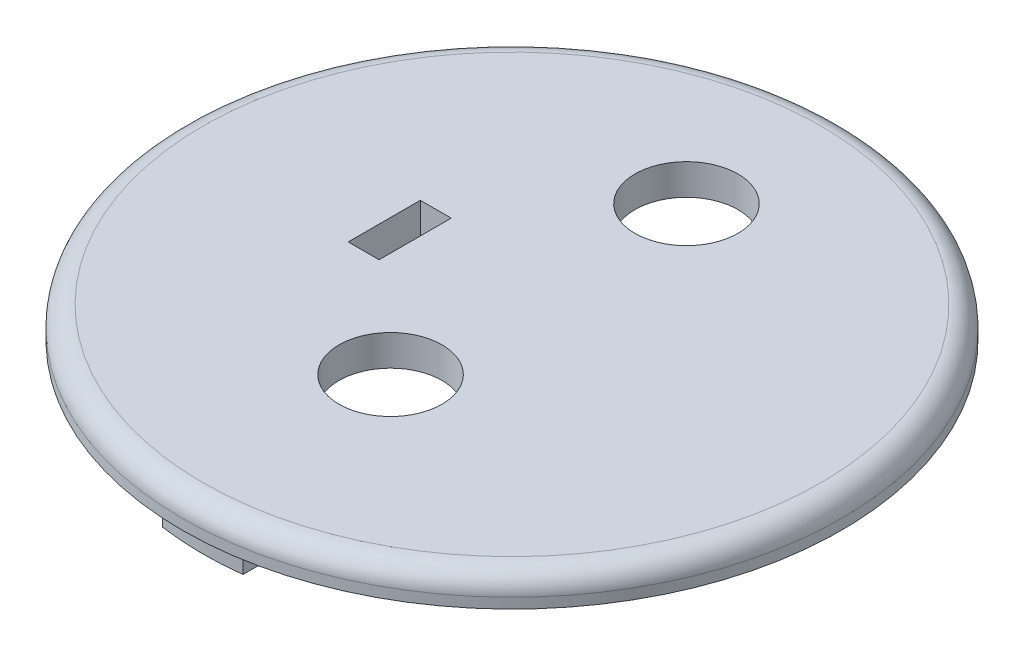
ISO-10303-21;
HEADER;
FILE_DESCRIPTION(('STEP AP214'),'2;1');
FILE_NAME('part.step','',(''),(''),'','','');
FILE_SCHEMA(('AUTOMOTIVE_DESIGN { 1 0 10303 214 1 1 1 1 }'));
ENDSEC;
DATA;
#1=APPLICATION_CONTEXT('core data for automotive mechanical design processes');
#2=APPLICATION_PROTOCOL_DEFINITION('international standard','automotive_design',2000,#1);
#3=PRODUCT_CONTEXT('',#1,'mechanical');
#4=PRODUCT('Part','Part','',(#3));
#5=PRODUCT_RELATED_PRODUCT_CATEGORY('part','',(#4));
#6=PRODUCT_DEFINITION_FORMATION('','',#4);
#7=PRODUCT_DEFINITION_CONTEXT('part definition',#1,'design');
#8=PRODUCT_DEFINITION('design','',#6,#7);
#9=PRODUCT_DEFINITION_SHAPE('','',#8);
#10=(LENGTH_UNIT() NAMED_UNIT(*) SI_UNIT(.MILLI.,.METRE.));
#11=(NAMED_UNIT(*) PLANE_ANGLE_UNIT() SI_UNIT($,.RADIAN.));
#12=(NAMED_UNIT(*) SI_UNIT($,.STERADIAN.) SOLID_ANGLE_UNIT());
#13=UNCERTAINTY_MEASURE_WITH_UNIT(LENGTH_MEASURE(1.E-05),#10,'distance_accuracy_value','');
#14=(GEOMETRIC_REPRESENTATION_CONTEXT(3) GLOBAL_UNCERTAINTY_ASSIGNED_CONTEXT((#13)) GLOBAL_UNIT_ASSIGNED_CONTEXT((#10,
#11,#12)) REPRESENTATION_CONTEXT('',''));
#15=CARTESIAN_POINT('',(0.,0.,0.));
#16=DIRECTION('',(0.,0.,1.));
#17=DIRECTION('',(1.,0.,0.));
#18=AXIS2_PLACEMENT_3D('',#15,#16,#17);
#19=CARTESIAN_POINT('',(0.,0.,0.));
#20=DIRECTION('',(0.,1.,0.));
#21=DIRECTION('',(0.,0.,1.));
#22=AXIS2_PLACEMENT_3D('',#19,#20,#21);
#23=PLANE('',#22);
#24=DIRECTION('',(-1.,0.,0.));
#25=VECTOR('',#24,1.);
#26=CARTESIAN_POINT('',(0.,0.,-4.29999938754221));
#27=LINE('',#26,#25);
#28=CARTESIAN_POINT('',(-10.203666827686,0.,-4.29999938754221));
#29=VERTEX_POINT('',#28);
#30=CARTESIAN_POINT('',(-13.203666827686,0.,-4.29999938754221));
#31=VERTEX_POINT('',#30);
#32=EDGE_CURVE('E158',#29,#31,#27,.T.);
#33=ORIENTED_EDGE('',*,*,#32,.T.);
#34=DIRECTION('',(0.,0.,1.));
#35=VECTOR('',#34,1.);
#36=CARTESIAN_POINT('',(-13.203666827686,0.,0.));
#37=LINE('',#36,#35);
#38=CARTESIAN_POINT('',(-13.203666827686,0.,2.70000061245779));
#39=VERTEX_POINT('',#38);
#40=EDGE_CURVE('E161',#31,#39,#37,.T.);
#41=ORIENTED_EDGE('',*,*,#40,.T.);
#42=DIRECTION('',(1.,0.,0.));
#43=VECTOR('',#42,1.);
#44=CARTESIAN_POINT('',(0.,0.,2.70000061245779));
#45=LINE('',#44,#43);
#46=CARTESIAN_POINT('',(-10.203666827686,0.,2.70000061245779));
#47=VERTEX_POINT('',#46);
#48=EDGE_CURVE('E153',#39,#47,#45,.T.);
#49=ORIENTED_EDGE('',*,*,#48,.T.);
#50=DIRECTION('',(0.,0.,-1.));
#51=VECTOR('',#50,1.);
#52=CARTESIAN_POINT('',(-10.203666827686,0.,0.));
#53=LINE('',#52,#51);
#54=EDGE_CURVE('E133',#47,#29,#53,.T.);
#55=ORIENTED_EDGE('',*,*,#54,.T.);
#56=EDGE_LOOP('',(#33,#41,#49,#55));
#57=FACE_BOUND('',#56,.T.);
#58=CARTESIAN_POINT('',(0.,0.,-16.9396462564265));
#59=DIRECTION('',(0.,1.,0.));
#60=DIRECTION('',(0.,0.,1.));
#61=AXIS2_PLACEMENT_3D('',#58,#59,#60);
#62=CIRCLE('',#61,5.);
#63=CARTESIAN_POINT('',(0.,0.,-11.9396462564265));
#64=VERTEX_POINT('',#63);
#65=EDGE_CURVE('E243',#64,#64,#62,.T.);
#66=ORIENTED_EDGE('',*,*,#65,.T.);
#67=EDGE_LOOP('',(#66));
#68=FACE_BOUND('',#67,.T.);
#69=CARTESIAN_POINT('',(0.,0.,11.7956699063071));
#70=DIRECTION('',(0.,1.,0.));
#71=DIRECTION('',(0.,0.,1.));
#72=AXIS2_PLACEMENT_3D('',#69,#70,#71);
#73=CIRCLE('',#72,5.);
#74=CARTESIAN_POINT('',(0.,0.,16.7956699063071));
#75=VERTEX_POINT('',#74);
#76=EDGE_CURVE('E242',#75,#75,#73,.T.);
#77=ORIENTED_EDGE('',*,*,#76,.T.);
#78=EDGE_LOOP('',(#77));
#79=FACE_BOUND('',#78,.T.);
#80=CARTESIAN_POINT('',(0.,0.,0.));
#81=DIRECTION('',(0.,1.,0.));
#82=DIRECTION('',(0.,0.,1.));
#83=AXIS2_PLACEMENT_3D('',#80,#81,#82);
#84=CIRCLE('',#83,32.);
#85=CARTESIAN_POINT('',(0.,0.,32.));
#86=VERTEX_POINT('',#85);
#87=EDGE_CURVE('E250',#86,#86,#84,.T.);
#88=ORIENTED_EDGE('',*,*,#87,.F.);
#89=EDGE_LOOP('',(#88));
#90=FACE_BOUND('',#89,.T.);
#91=CARTESIAN_POINT('',(-4.25281447665018,0.,-29.6970296330659));
#92=CARTESIAN_POINT('',(-0.301616898279549,0.,-30.2601976972511));
#93=CARTESIAN_POINT('',(3.65484317004238,0.,-29.7765364238757));
#94=B_SPLINE_CURVE_WITH_KNOTS('',2,(#91,#92,#93),.UNSPECIFIED.,.F.,.F.,(3,3),(0.,1.),.UNSPECIFIED.);
#95=CARTESIAN_POINT('',(-4.25281447665018,0.,-29.6970296330659));
#96=VERTEX_POINT('',#95);
#97=CARTESIAN_POINT('',(3.65484317004238,0.,-29.7765364238757));
#98=VERTEX_POINT('',#97);
#99=EDGE_CURVE('E238',#96,#98,#94,.T.);
#100=ORIENTED_EDGE('',*,*,#99,.F.);
#101=DIRECTION('',(0.,0.,1.));
#102=VECTOR('',#101,1.);
#103=CARTESIAN_POINT('',(-4.25281447665018,0.,-29.6970296330659));
#104=LINE('',#103,#102);
#105=CARTESIAN_POINT('',(-4.25281447665018,0.,-28.0928707699777));
#106=VERTEX_POINT('',#105);
#107=EDGE_CURVE('E225',#96,#106,#104,.T.);
#108=ORIENTED_EDGE('',*,*,#107,.T.);
#109=DIRECTION('',(1.,0.,0.));
#110=VECTOR('',#109,1.);
#111=CARTESIAN_POINT('',(-4.25281447665018,0.,-28.0928707699777));
#112=LINE('',#111,#110);
#113=CARTESIAN_POINT('',(3.65484317004238,0.,-28.0928707699777));
#114=VERTEX_POINT('',#113);
#115=EDGE_CURVE('E333',#106,#114,#112,.T.);
#116=ORIENTED_EDGE('',*,*,#115,.T.);
#117=DIRECTION('',(0.,0.,-1.));
#118=VECTOR('',#117,1.);
#119=CARTESIAN_POINT('',(3.65484317004238,0.,-28.0928707699777));
#120=LINE('',#119,#118);
#121=EDGE_CURVE('E329',#114,#98,#120,.T.);
#122=ORIENTED_EDGE('',*,*,#121,.T.);
#123=EDGE_LOOP('',(#100,#108,#116,#122));
#124=FACE_BOUND('',#123,.T.);
#125=DIRECTION('',(1.,0.,0.));
#126=VECTOR('',#125,1.);
#127=CARTESIAN_POINT('',(-4.25281447665018,0.,28.0928707699777));
#128=LINE('',#127,#126);
#129=CARTESIAN_POINT('',(-4.25281447665018,0.,28.0928707699777));
#130=VERTEX_POINT('',#129);
#131=CARTESIAN_POINT('',(3.65484317004238,0.,28.0928707699777));
#132=VERTEX_POINT('',#131);
#133=EDGE_CURVE('E294',#130,#132,#128,.T.);
#134=ORIENTED_EDGE('',*,*,#133,.F.);
#135=DIRECTION('',(0.,0.,-1.));
#136=VECTOR('',#135,1.);
#137=CARTESIAN_POINT('',(-4.25281447665018,0.,29.6970296330659));
#138=LINE('',#137,#136);
#139=CARTESIAN_POINT('',(-4.25281447665018,0.,29.6970296330659));
#140=VERTEX_POINT('',#139);
#141=EDGE_CURVE('E169',#140,#130,#138,.T.);
#142=ORIENTED_EDGE('',*,*,#141,.F.);
#143=CARTESIAN_POINT('',(-4.25281447665018,0.,29.6970296330659));
#144=CARTESIAN_POINT('',(-0.301616898279549,0.,30.2601976972511));
#145=CARTESIAN_POINT('',(3.65484317004238,0.,29.7765364238757));
#146=B_SPLINE_CURVE_WITH_KNOTS('',2,(#143,#144,#145),.UNSPECIFIED.,.F.,.F.,(3,3),(0.,1.),.UNSPECIFIED.);
#147=CARTESIAN_POINT('',(3.65484317004238,0.,29.7765364238757));
#148=VERTEX_POINT('',#147);
#149=EDGE_CURVE('E309',#140,#148,#146,.T.);
#150=ORIENTED_EDGE('',*,*,#149,.T.);
#151=DIRECTION('',(0.,0.,1.));
#152=VECTOR('',#151,1.);
#153=CARTESIAN_POINT('',(3.65484317004238,0.,28.0928707699777));
#154=LINE('',#153,#152);
#155=EDGE_CURVE('E298',#132,#148,#154,.T.);
#156=ORIENTED_EDGE('',*,*,#155,.F.);
#157=EDGE_LOOP('',(#134,#142,#150,#156));
#158=FACE_BOUND('',#157,.T.);
#159=ADVANCED_FACE('F38',(#57,#68,#79,#90,#124,#158),#23,.F.);
#160=CARTESIAN_POINT('',(0.,3.,0.));
#161=DIRECTION('',(0.,1.,0.));
#162=DIRECTION('',(0.,0.,1.));
#163=AXIS2_PLACEMENT_3D('',#160,#161,#162);
#164=PLANE('',#163);
#165=DIRECTION('',(0.,0.,1.));
#166=VECTOR('',#165,1.);
#167=CARTESIAN_POINT('',(-13.203666827686,3.,-4.29999938754221));
#168=LINE('',#167,#166);
#169=CARTESIAN_POINT('',(-13.203666827686,3.,-4.29999938754221));
#170=VERTEX_POINT('',#169);
#171=CARTESIAN_POINT('',(-13.203666827686,3.,2.70000061245779));
#172=VERTEX_POINT('',#171);
#173=EDGE_CURVE('E61',#170,#172,#168,.T.);
#174=ORIENTED_EDGE('',*,*,#173,.F.);
#175=DIRECTION('',(-1.,0.,0.));
#176=VECTOR('',#175,1.);
#177=CARTESIAN_POINT('',(-13.203666827686,3.,-4.29999938754221));
#178=LINE('',#177,#176);
#179=CARTESIAN_POINT('',(-10.203666827686,3.,-4.29999938754221));
#180=VERTEX_POINT('',#179);
#181=EDGE_CURVE('E146',#180,#170,#178,.T.);
#182=ORIENTED_EDGE('',*,*,#181,.F.);
#183=DIRECTION('',(0.,0.,-1.));
#184=VECTOR('',#183,1.);
#185=CARTESIAN_POINT('',(-10.203666827686,3.,-4.29999938754221));
#186=LINE('',#185,#184);
#187=CARTESIAN_POINT('',(-10.203666827686,3.,2.70000061245779));
#188=VERTEX_POINT('',#187);
#189=EDGE_CURVE('E130',#188,#180,#186,.T.);
#190=ORIENTED_EDGE('',*,*,#189,.F.);
#191=DIRECTION('',(1.,0.,0.));
#192=VECTOR('',#191,1.);
#193=CARTESIAN_POINT('',(-13.203666827686,3.,2.70000061245779));
#194=LINE('',#193,#192);
#195=EDGE_CURVE('E139',#172,#188,#194,.T.);
#196=ORIENTED_EDGE('',*,*,#195,.F.);
#197=EDGE_LOOP('',(#174,#182,#190,#196));
#198=FACE_BOUND('',#197,.T.);
#199=CARTESIAN_POINT('',(0.,3.,0.));
#200=DIRECTION('',(0.,1.,0.));
#201=DIRECTION('',(0.,0.,1.));
#202=AXIS2_PLACEMENT_3D('',#199,#200,#201);
#203=CIRCLE('',#202,30.);
#204=CARTESIAN_POINT('',(0.,3.,30.));
#205=VERTEX_POINT('',#204);
#206=EDGE_CURVE('E46',#205,#205,#203,.T.);
#207=ORIENTED_EDGE('',*,*,#206,.T.);
#208=EDGE_LOOP('',(#207));
#209=FACE_BOUND('',#208,.T.);
#210=CARTESIAN_POINT('',(0.,3.,11.7956699063071));
#211=DIRECTION('',(0.,1.,0.));
#212=DIRECTION('',(0.,0.,1.));
#213=AXIS2_PLACEMENT_3D('',#210,#211,#212);
#214=CIRCLE('',#213,5.);
#215=CARTESIAN_POINT('',(0.,3.,16.7956699063071));
#216=VERTEX_POINT('',#215);
#217=EDGE_CURVE('E247',#216,#216,#214,.T.);
#218=ORIENTED_EDGE('',*,*,#217,.F.);
#219=EDGE_LOOP('',(#218));
#220=FACE_BOUND('',#219,.T.);
#221=CARTESIAN_POINT('',(0.,3.,-16.9396462564265));
#222=DIRECTION('',(0.,1.,0.));
#223=DIRECTION('',(0.,0.,1.));
#224=AXIS2_PLACEMENT_3D('',#221,#222,#223);
#225=CIRCLE('',#224,5.);
#226=CARTESIAN_POINT('',(0.,3.,-11.9396462564265));
#227=VERTEX_POINT('',#226);
#228=EDGE_CURVE('E239',#227,#227,#225,.T.);
#229=ORIENTED_EDGE('',*,*,#228,.F.);
#230=EDGE_LOOP('',(#229));
#231=FACE_BOUND('',#230,.T.);
#232=ADVANCED_FACE('F143',(#198,#209,#220,#231),#164,.T.);
#233=CARTESIAN_POINT('',(0.,3.,0.));
#234=DIRECTION('',(0.,-1.,0.));
#235=DIRECTION('',(0.,0.,-1.));
#236=AXIS2_PLACEMENT_3D('',#233,#234,#235);
#237=CYLINDRICAL_SURFACE('',#236,32.);
#238=CARTESIAN_POINT('',(0.,1.,0.));
#239=DIRECTION('',(0.,1.,0.));
#240=DIRECTION('',(0.,0.,1.));
#241=AXIS2_PLACEMENT_3D('',#238,#239,#240);
#242=CIRCLE('',#241,32.);
#243=CARTESIAN_POINT('',(0.,1.,32.));
#244=VERTEX_POINT('',#243);
#245=EDGE_CURVE('E11',#244,#244,#242,.F.);
#246=ORIENTED_EDGE('',*,*,#245,.T.);
#247=EDGE_LOOP('',(#246));
#248=FACE_BOUND('',#247,.T.);
#249=ORIENTED_EDGE('',*,*,#87,.T.);
#250=EDGE_LOOP('',(#249));
#251=FACE_BOUND('',#250,.T.);
#252=ADVANCED_FACE('F275',(#248,#251),#237,.T.);
#253=CARTESIAN_POINT('',(0.,3.,11.7956699063071));
#254=DIRECTION('',(0.,-1.,0.));
#255=DIRECTION('',(0.,0.,-1.));
#256=AXIS2_PLACEMENT_3D('',#253,#254,#255);
#257=CYLINDRICAL_SURFACE('',#256,5.);
#258=ORIENTED_EDGE('',*,*,#217,.T.);
#259=EDGE_LOOP('',(#258));
#260=FACE_BOUND('',#259,.T.);
#261=ORIENTED_EDGE('',*,*,#76,.F.);
#262=EDGE_LOOP('',(#261));
#263=FACE_BOUND('',#262,.T.);
#264=ADVANCED_FACE('F265',(#260,#263),#257,.F.);
#265=CARTESIAN_POINT('',(0.,3.,-16.9396462564265));
#266=DIRECTION('',(0.,-1.,0.));
#267=DIRECTION('',(0.,0.,-1.));
#268=AXIS2_PLACEMENT_3D('',#265,#266,#267);
#269=CYLINDRICAL_SURFACE('',#268,5.);
#270=ORIENTED_EDGE('',*,*,#228,.T.);
#271=EDGE_LOOP('',(#270));
#272=FACE_BOUND('',#271,.T.);
#273=ORIENTED_EDGE('',*,*,#65,.F.);
#274=EDGE_LOOP('',(#273));
#275=FACE_BOUND('',#274,.T.);
#276=ADVANCED_FACE('F259',(#272,#275),#269,.F.);
#277=CARTESIAN_POINT('',(0.,1.,0.));
#278=DIRECTION('',(0.,1.,0.));
#279=DIRECTION('',(0.,0.,1.));
#280=AXIS2_PLACEMENT_3D('',#277,#278,#279);
#281=TOROIDAL_SURFACE('',#280,30.,2.);
#282=ORIENTED_EDGE('',*,*,#245,.F.);
#283=EDGE_LOOP('',(#282));
#284=FACE_BOUND('',#283,.T.);
#285=ORIENTED_EDGE('',*,*,#206,.F.);
#286=EDGE_LOOP('',(#285));
#287=FACE_BOUND('',#286,.T.);
#288=ADVANCED_FACE('F40',(#284,#287),#281,.T.);
#289=CARTESIAN_POINT('',(-4.25281447665018,-3.,-29.6970296330659));
#290=DIRECTION('',(-1.,0.,0.));
#291=DIRECTION('',(0.,0.,1.));
#292=AXIS2_PLACEMENT_3D('',#289,#290,#291);
#293=PLANE('',#292);
#294=ORIENTED_EDGE('',*,*,#107,.F.);
#295=DIRECTION('',(0.,1.,0.));
#296=VECTOR('',#295,1.);
#297=CARTESIAN_POINT('',(-4.25281447665018,-3.,-29.6970296330659));
#298=LINE('',#297,#296);
#299=CARTESIAN_POINT('',(-4.25281447665018,-3.,-29.6970296330659));
#300=VERTEX_POINT('',#299);
#301=EDGE_CURVE('E164',#300,#96,#298,.T.);
#302=ORIENTED_EDGE('',*,*,#301,.F.);
#303=DIRECTION('',(0.,0.,1.));
#304=VECTOR('',#303,1.);
#305=CARTESIAN_POINT('',(-4.25281447665018,-3.,-29.6970296330659));
#306=LINE('',#305,#304);
#307=CARTESIAN_POINT('',(-4.25281447665018,-3.,-28.0928707699777));
#308=VERTEX_POINT('',#307);
#309=EDGE_CURVE('E235',#300,#308,#306,.T.);
#310=ORIENTED_EDGE('',*,*,#309,.T.);
#311=DIRECTION('',(0.,1.,0.));
#312=VECTOR('',#311,1.);
#313=CARTESIAN_POINT('',(-4.25281447665018,-3.,-28.0928707699777));
#314=LINE('',#313,#312);
#315=EDGE_CURVE('E224',#308,#106,#314,.T.);
#316=ORIENTED_EDGE('',*,*,#315,.T.);
#317=EDGE_LOOP('',(#294,#302,#310,#316));
#318=FACE_BOUND('',#317,.T.);
#319=ADVANCED_FACE('F199',(#318),#293,.T.);
#320=CARTESIAN_POINT('',(-4.25281447665018,-3.,-29.6970296330659));
#321=CARTESIAN_POINT('',(-0.301616898279549,-3.,-30.2601976972511));
#322=CARTESIAN_POINT('',(3.65484317004238,-3.,-29.7765364238757));
#323=B_SPLINE_CURVE_WITH_KNOTS('',2,(#320,#321,#322),.UNSPECIFIED.,.F.,.F.,(3,3),(0.,1.),.UNSPECIFIED.);
#324=DIRECTION('',(0.,1.,0.));
#325=VECTOR('',#324,1.);
#326=SURFACE_OF_LINEAR_EXTRUSION('',#323,#325);
#327=ORIENTED_EDGE('',*,*,#99,.T.);
#328=DIRECTION('',(0.,1.,0.));
#329=VECTOR('',#328,1.);
#330=CARTESIAN_POINT('',(3.65484317004238,-3.,-29.7765364238757));
#331=LINE('',#330,#329);
#332=CARTESIAN_POINT('',(3.65484317004238,-3.,-29.7765364238757));
#333=VERTEX_POINT('',#332);
#334=EDGE_CURVE('E323',#333,#98,#331,.T.);
#335=ORIENTED_EDGE('',*,*,#334,.F.);
#336=EDGE_CURVE('E217',#300,#333,#323,.T.);
#337=ORIENTED_EDGE('',*,*,#336,.F.);
#338=ORIENTED_EDGE('',*,*,#301,.T.);
#339=EDGE_LOOP('',(#327,#335,#337,#338));
#340=FACE_BOUND('',#339,.T.);
#341=ADVANCED_FACE('F202',(#340),#326,.F.);
#342=CARTESIAN_POINT('',(3.65484317004238,-3.,-28.0928707699777));
#343=DIRECTION('',(1.,0.,0.));
#344=DIRECTION('',(0.,0.,-1.));
#345=AXIS2_PLACEMENT_3D('',#342,#343,#344);
#346=PLANE('',#345);
#347=ORIENTED_EDGE('',*,*,#121,.F.);
#348=DIRECTION('',(0.,1.,0.));
#349=VECTOR('',#348,1.);
#350=CARTESIAN_POINT('',(3.65484317004238,-3.,-28.0928707699777));
#351=LINE('',#350,#349);
#352=CARTESIAN_POINT('',(3.65484317004238,-3.,-28.0928707699777));
#353=VERTEX_POINT('',#352);
#354=EDGE_CURVE('E320',#353,#114,#351,.T.);
#355=ORIENTED_EDGE('',*,*,#354,.F.);
#356=DIRECTION('',(0.,0.,-1.));
#357=VECTOR('',#356,1.);
#358=CARTESIAN_POINT('',(3.65484317004238,-3.,-28.0928707699777));
#359=LINE('',#358,#357);
#360=EDGE_CURVE('E223',#353,#333,#359,.T.);
#361=ORIENTED_EDGE('',*,*,#360,.T.);
#362=ORIENTED_EDGE('',*,*,#334,.T.);
#363=EDGE_LOOP('',(#347,#355,#361,#362));
#364=FACE_BOUND('',#363,.T.);
#365=ADVANCED_FACE('F207',(#364),#346,.T.);
#366=CARTESIAN_POINT('',(-4.25281447665018,-3.,-28.0928707699777));
#367=DIRECTION('',(0.,0.,1.));
#368=DIRECTION('',(1.,0.,0.));
#369=AXIS2_PLACEMENT_3D('',#366,#367,#368);
#370=PLANE('',#369);
#371=ORIENTED_EDGE('',*,*,#115,.F.);
#372=ORIENTED_EDGE('',*,*,#315,.F.);
#373=DIRECTION('',(1.,0.,0.));
#374=VECTOR('',#373,1.);
#375=CARTESIAN_POINT('',(-4.25281447665018,-3.,-28.0928707699777));
#376=LINE('',#375,#374);
#377=EDGE_CURVE('E232',#308,#353,#376,.T.);
#378=ORIENTED_EDGE('',*,*,#377,.T.);
#379=ORIENTED_EDGE('',*,*,#354,.T.);
#380=EDGE_LOOP('',(#371,#372,#378,#379));
#381=FACE_BOUND('',#380,.T.);
#382=ADVANCED_FACE('F204',(#381),#370,.T.);
#383=CARTESIAN_POINT('',(-0.300301275791724,-3.,-29.998490362861));
#384=DIRECTION('',(0.,1.,0.));
#385=DIRECTION('',(0.,0.,1.));
#386=AXIS2_PLACEMENT_3D('',#383,#384,#385);
#387=PLANE('',#386);
#388=ORIENTED_EDGE('',*,*,#309,.F.);
#389=ORIENTED_EDGE('',*,*,#336,.T.);
#390=ORIENTED_EDGE('',*,*,#360,.F.);
#391=ORIENTED_EDGE('',*,*,#377,.F.);
#392=EDGE_LOOP('',(#388,#389,#390,#391));
#393=FACE_BOUND('',#392,.T.);
#394=ADVANCED_FACE('F197',(#393),#387,.F.);
#395=CARTESIAN_POINT('',(-4.25281447665018,-3.,28.0928707699777));
#396=DIRECTION('',(0.,0.,1.));
#397=DIRECTION('',(1.,0.,0.));
#398=AXIS2_PLACEMENT_3D('',#395,#396,#397);
#399=PLANE('',#398);
#400=ORIENTED_EDGE('',*,*,#133,.T.);
#401=DIRECTION('',(0.,1.,0.));
#402=VECTOR('',#401,1.);
#403=CARTESIAN_POINT('',(3.65484317004238,-3.,28.0928707699777));
#404=LINE('',#403,#402);
#405=CARTESIAN_POINT('',(3.65484317004238,-3.,28.0928707699777));
#406=VERTEX_POINT('',#405);
#407=EDGE_CURVE('E246',#406,#132,#404,.T.);
#408=ORIENTED_EDGE('',*,*,#407,.F.);
#409=DIRECTION('',(1.,0.,0.));
#410=VECTOR('',#409,1.);
#411=CARTESIAN_POINT('',(-4.25281447665018,-3.,28.0928707699777));
#412=LINE('',#411,#410);
#413=CARTESIAN_POINT('',(-4.25281447665018,-3.,28.0928707699777));
#414=VERTEX_POINT('',#413);
#415=EDGE_CURVE('E165',#414,#406,#412,.T.);
#416=ORIENTED_EDGE('',*,*,#415,.F.);
#417=DIRECTION('',(0.,1.,0.));
#418=VECTOR('',#417,1.);
#419=CARTESIAN_POINT('',(-4.25281447665018,-3.,28.0928707699777));
#420=LINE('',#419,#418);
#421=EDGE_CURVE('E305',#414,#130,#420,.T.);
#422=ORIENTED_EDGE('',*,*,#421,.T.);
#423=EDGE_LOOP('',(#400,#408,#416,#422));
#424=FACE_BOUND('',#423,.T.);
#425=ADVANCED_FACE('F193',(#424),#399,.F.);
#426=CARTESIAN_POINT('',(3.65484317004238,-3.,28.0928707699777));
#427=DIRECTION('',(-1.,0.,0.));
#428=DIRECTION('',(0.,0.,1.));
#429=AXIS2_PLACEMENT_3D('',#426,#427,#428);
#430=PLANE('',#429);
#431=ORIENTED_EDGE('',*,*,#155,.T.);
#432=DIRECTION('',(0.,1.,0.));
#433=VECTOR('',#432,1.);
#434=CARTESIAN_POINT('',(3.65484317004238,-3.,29.7765364238757));
#435=LINE('',#434,#433);
#436=CARTESIAN_POINT('',(3.65484317004238,-3.,29.7765364238757));
#437=VERTEX_POINT('',#436);
#438=EDGE_CURVE('E312',#437,#148,#435,.T.);
#439=ORIENTED_EDGE('',*,*,#438,.F.);
#440=DIRECTION('',(0.,0.,1.));
#441=VECTOR('',#440,1.);
#442=CARTESIAN_POINT('',(3.65484317004238,-3.,28.0928707699777));
#443=LINE('',#442,#441);
#444=EDGE_CURVE('E168',#406,#437,#443,.T.);
#445=ORIENTED_EDGE('',*,*,#444,.F.);
#446=ORIENTED_EDGE('',*,*,#407,.T.);
#447=EDGE_LOOP('',(#431,#439,#445,#446));
#448=FACE_BOUND('',#447,.T.);
#449=ADVANCED_FACE('F188',(#448),#430,.F.);
#450=CARTESIAN_POINT('',(-4.25281447665018,-3.,29.6970296330659));
#451=CARTESIAN_POINT('',(-0.301616898279549,-3.,30.2601976972511));
#452=CARTESIAN_POINT('',(3.65484317004238,-3.,29.7765364238757));
#453=B_SPLINE_CURVE_WITH_KNOTS('',2,(#450,#451,#452),.UNSPECIFIED.,.F.,.F.,(3,3),(0.,1.),.UNSPECIFIED.);
#454=DIRECTION('',(0.,1.,0.));
#455=VECTOR('',#454,1.);
#456=SURFACE_OF_LINEAR_EXTRUSION('',#453,#455);
#457=ORIENTED_EDGE('',*,*,#149,.F.);
#458=DIRECTION('',(0.,1.,0.));
#459=VECTOR('',#458,1.);
#460=CARTESIAN_POINT('',(-4.25281447665018,-3.,29.6970296330659));
#461=LINE('',#460,#459);
#462=CARTESIAN_POINT('',(-4.25281447665018,-3.,29.6970296330659));
#463=VERTEX_POINT('',#462);
#464=EDGE_CURVE('E307',#463,#140,#461,.T.);
#465=ORIENTED_EDGE('',*,*,#464,.F.);
#466=EDGE_CURVE('E171',#463,#437,#453,.T.);
#467=ORIENTED_EDGE('',*,*,#466,.T.);
#468=ORIENTED_EDGE('',*,*,#438,.T.);
#469=EDGE_LOOP('',(#457,#465,#467,#468));
#470=FACE_BOUND('',#469,.T.);
#471=ADVANCED_FACE('F183',(#470),#456,.T.);
#472=CARTESIAN_POINT('',(-4.25281447665018,-3.,29.6970296330659));
#473=DIRECTION('',(1.,0.,0.));
#474=DIRECTION('',(0.,0.,-1.));
#475=AXIS2_PLACEMENT_3D('',#472,#473,#474);
#476=PLANE('',#475);
#477=ORIENTED_EDGE('',*,*,#141,.T.);
#478=ORIENTED_EDGE('',*,*,#421,.F.);
#479=DIRECTION('',(0.,0.,-1.));
#480=VECTOR('',#479,1.);
#481=CARTESIAN_POINT('',(-4.25281447665018,-3.,29.6970296330659));
#482=LINE('',#481,#480);
#483=EDGE_CURVE('E177',#463,#414,#482,.T.);
#484=ORIENTED_EDGE('',*,*,#483,.F.);
#485=ORIENTED_EDGE('',*,*,#464,.T.);
#486=EDGE_LOOP('',(#477,#478,#484,#485));
#487=FACE_BOUND('',#486,.T.);
#488=ADVANCED_FACE('F187',(#487),#476,.F.);
#489=CARTESIAN_POINT('',(-0.300301275791724,-3.,29.998490362861));
#490=DIRECTION('',(0.,-1.,0.));
#491=DIRECTION('',(0.,0.,-1.));
#492=AXIS2_PLACEMENT_3D('',#489,#490,#491);
#493=PLANE('',#492);
#494=ORIENTED_EDGE('',*,*,#415,.T.);
#495=ORIENTED_EDGE('',*,*,#444,.T.);
#496=ORIENTED_EDGE('',*,*,#466,.F.);
#497=ORIENTED_EDGE('',*,*,#483,.T.);
#498=EDGE_LOOP('',(#494,#495,#496,#497));
#499=FACE_BOUND('',#498,.T.);
#500=ADVANCED_FACE('F369',(#499),#493,.T.);
#501=CARTESIAN_POINT('',(-13.203666827686,-7.,-4.29999938754221));
#502=DIRECTION('',(-1.,0.,0.));
#503=DIRECTION('',(0.,0.,1.));
#504=AXIS2_PLACEMENT_3D('',#501,#502,#503);
#505=PLANE('',#504);
#506=DIRECTION('',(0.,1.,0.));
#507=VECTOR('',#506,1.);
#508=CARTESIAN_POINT('',(-13.203666827686,-7.,-4.29999938754221));
#509=LINE('',#508,#507);
#510=EDGE_CURVE('E151',#31,#170,#509,.T.);
#511=ORIENTED_EDGE('',*,*,#510,.T.);
#512=ORIENTED_EDGE('',*,*,#173,.T.);
#513=DIRECTION('',(0.,1.,0.));
#514=VECTOR('',#513,1.);
#515=CARTESIAN_POINT('',(-13.203666827686,-7.,2.70000061245779));
#516=LINE('',#515,#514);
#517=EDGE_CURVE('E136',#39,#172,#516,.T.);
#518=ORIENTED_EDGE('',*,*,#517,.F.);
#519=ORIENTED_EDGE('',*,*,#40,.F.);
#520=EDGE_LOOP('',(#511,#512,#518,#519));
#521=FACE_BOUND('',#520,.T.);
#522=ADVANCED_FACE('F375',(#521),#505,.F.);
#523=CARTESIAN_POINT('',(-13.203666827686,-7.,-4.29999938754221));
#524=DIRECTION('',(0.,0.,-1.));
#525=DIRECTION('',(-1.,0.,0.));
#526=AXIS2_PLACEMENT_3D('',#523,#524,#525);
#527=PLANE('',#526);
#528=DIRECTION('',(0.,1.,0.));
#529=VECTOR('',#528,1.);
#530=CARTESIAN_POINT('',(-10.203666827686,-7.,-4.29999938754221));
#531=LINE('',#530,#529);
#532=EDGE_CURVE('E135',#29,#180,#531,.T.);
#533=ORIENTED_EDGE('',*,*,#532,.T.);
#534=ORIENTED_EDGE('',*,*,#181,.T.);
#535=ORIENTED_EDGE('',*,*,#510,.F.);
#536=ORIENTED_EDGE('',*,*,#32,.F.);
#537=EDGE_LOOP('',(#533,#534,#535,#536));
#538=FACE_BOUND('',#537,.T.);
#539=ADVANCED_FACE('F387',(#538),#527,.F.);
#540=CARTESIAN_POINT('',(-10.203666827686,-7.,-4.29999938754221));
#541=DIRECTION('',(1.,0.,0.));
#542=DIRECTION('',(0.,0.,-1.));
#543=AXIS2_PLACEMENT_3D('',#540,#541,#542);
#544=PLANE('',#543);
#545=DIRECTION('',(0.,1.,0.));
#546=VECTOR('',#545,1.);
#547=CARTESIAN_POINT('',(-10.203666827686,-7.,2.70000061245779));
#548=LINE('',#547,#546);
#549=EDGE_CURVE('E53',#47,#188,#548,.T.);
#550=ORIENTED_EDGE('',*,*,#549,.T.);
#551=ORIENTED_EDGE('',*,*,#189,.T.);
#552=ORIENTED_EDGE('',*,*,#532,.F.);
#553=ORIENTED_EDGE('',*,*,#54,.F.);
#554=EDGE_LOOP('',(#550,#551,#552,#553));
#555=FACE_BOUND('',#554,.T.);
#556=ADVANCED_FACE('F127',(#555),#544,.F.);
#557=CARTESIAN_POINT('',(-13.203666827686,-7.,2.70000061245779));
#558=DIRECTION('',(0.,0.,1.));
#559=DIRECTION('',(1.,0.,0.));
#560=AXIS2_PLACEMENT_3D('',#557,#558,#559);
#561=PLANE('',#560);
#562=ORIENTED_EDGE('',*,*,#517,.T.);
#563=ORIENTED_EDGE('',*,*,#195,.T.);
#564=ORIENTED_EDGE('',*,*,#549,.F.);
#565=ORIENTED_EDGE('',*,*,#48,.F.);
#566=EDGE_LOOP('',(#562,#563,#564,#565));
#567=FACE_BOUND('',#566,.T.);
#568=ADVANCED_FACE('F140',(#567),#561,.F.);
#569=CLOSED_SHELL('',(#159,#232,#252,#264,#276,#288,#319,#341,#365,#382,#394,#425,#449,#471,
#488,#500,#522,#539,#556,#568));
#570=MANIFOLD_SOLID_BREP('B2',#569);
#571=ADVANCED_BREP_SHAPE_REPRESENTATION('',(#18,#570),#14);
#572=SHAPE_DEFINITION_REPRESENTATION(#9,#571);
ENDSEC;
END-ISO-10303-21;
